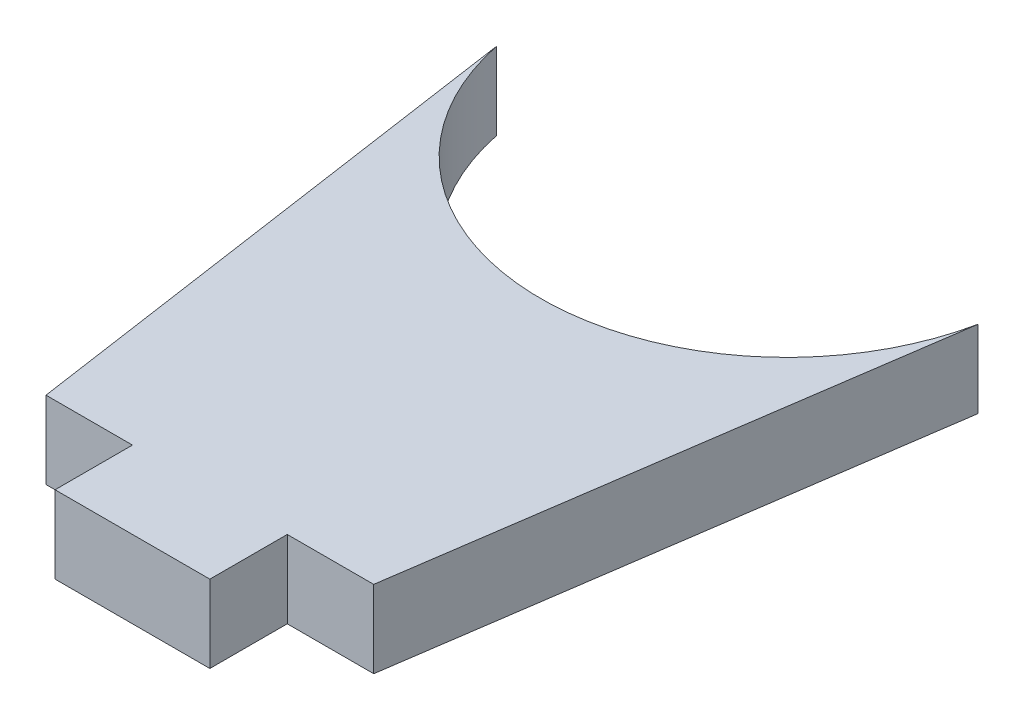
ISO-10303-21;
HEADER;
FILE_DESCRIPTION(('STEP AP214'),'2;1');
FILE_NAME('part.step','',(''),(''),'','','');
FILE_SCHEMA(('AUTOMOTIVE_DESIGN { 1 0 10303 214 1 1 1 1 }'));
ENDSEC;
DATA;
#1=APPLICATION_CONTEXT('core data for automotive mechanical design processes');
#2=APPLICATION_PROTOCOL_DEFINITION('international standard','automotive_design',2000,#1);
#3=PRODUCT_CONTEXT('',#1,'mechanical');
#4=PRODUCT('Part','Part','',(#3));
#5=PRODUCT_RELATED_PRODUCT_CATEGORY('part','',(#4));
#6=PRODUCT_DEFINITION_FORMATION('','',#4);
#7=PRODUCT_DEFINITION_CONTEXT('part definition',#1,'design');
#8=PRODUCT_DEFINITION('design','',#6,#7);
#9=PRODUCT_DEFINITION_SHAPE('','',#8);
#10=(LENGTH_UNIT() NAMED_UNIT(*) SI_UNIT(.MILLI.,.METRE.));
#11=(NAMED_UNIT(*) PLANE_ANGLE_UNIT() SI_UNIT($,.RADIAN.));
#12=(NAMED_UNIT(*) SI_UNIT($,.STERADIAN.) SOLID_ANGLE_UNIT());
#13=UNCERTAINTY_MEASURE_WITH_UNIT(LENGTH_MEASURE(1.E-05),#10,'distance_accuracy_value','');
#14=(GEOMETRIC_REPRESENTATION_CONTEXT(3) GLOBAL_UNCERTAINTY_ASSIGNED_CONTEXT((#13)) GLOBAL_UNIT_ASSIGNED_CONTEXT((#10,
#11,#12)) REPRESENTATION_CONTEXT('',''));
#15=CARTESIAN_POINT('',(0.,0.,0.));
#16=DIRECTION('',(0.,0.,1.));
#17=DIRECTION('',(1.,0.,0.));
#18=AXIS2_PLACEMENT_3D('',#15,#16,#17);
#19=CARTESIAN_POINT('',(0.,2.5,0.));
#20=DIRECTION('',(0.,-1.,0.));
#21=DIRECTION('',(0.,0.,-1.));
#22=AXIS2_PLACEMENT_3D('',#19,#20,#21);
#23=CYLINDRICAL_SURFACE('',#22,15.875);
#24=CARTESIAN_POINT('',(0.,-2.5,0.));
#25=DIRECTION('',(0.,1.,0.));
#26=DIRECTION('',(0.,0.,1.));
#27=AXIS2_PLACEMENT_3D('',#24,#25,#26);
#28=CIRCLE('',#27,15.875);
#29=CARTESIAN_POINT('',(-15.5513834842092,-2.5,3.1890589093123));
#30=VERTEX_POINT('',#29);
#31=CARTESIAN_POINT('',(15.5513834842092,-2.5,3.1890589093123));
#32=VERTEX_POINT('',#31);
#33=EDGE_CURVE('E131',#30,#32,#28,.T.);
#34=ORIENTED_EDGE('',*,*,#33,.F.);
#35=DIRECTION('',(0.,-1.,0.));
#36=VECTOR('',#35,1.);
#37=CARTESIAN_POINT('',(-15.5513834842092,2.5,3.1890589093123));
#38=LINE('',#37,#36);
#39=CARTESIAN_POINT('',(-15.5513834842092,2.5,3.1890589093123));
#40=VERTEX_POINT('',#39);
#41=EDGE_CURVE('E11',#40,#30,#38,.T.);
#42=ORIENTED_EDGE('',*,*,#41,.F.);
#43=CARTESIAN_POINT('',(0.,2.5,0.));
#44=DIRECTION('',(0.,1.,0.));
#45=DIRECTION('',(0.,0.,1.));
#46=AXIS2_PLACEMENT_3D('',#43,#44,#45);
#47=CIRCLE('',#46,15.875);
#48=CARTESIAN_POINT('',(15.5513834842092,2.5,3.1890589093123));
#49=VERTEX_POINT('',#48);
#50=EDGE_CURVE('E150',#40,#49,#47,.T.);
#51=ORIENTED_EDGE('',*,*,#50,.T.);
#52=DIRECTION('',(0.,-1.,0.));
#53=VECTOR('',#52,1.);
#54=CARTESIAN_POINT('',(15.5513834842092,2.5,3.1890589093123));
#55=LINE('',#54,#53);
#56=EDGE_CURVE('E89',#49,#32,#55,.T.);
#57=ORIENTED_EDGE('',*,*,#56,.T.);
#58=EDGE_LOOP('',(#34,#42,#51,#57));
#59=FACE_BOUND('',#58,.T.);
#60=ADVANCED_FACE('F39',(#59),#23,.F.);
#61=CARTESIAN_POINT('',(-15.6829871582078,2.5,2.28632816271574));
#62=DIRECTION('',(-0.989539954782991,0.,0.144259065185089));
#63=DIRECTION('',(0.144259065185089,0.,0.989539954782991));
#64=AXIS2_PLACEMENT_3D('',#61,#62,#63);
#65=PLANE('',#64);
#66=DIRECTION('',(-0.144259065185089,0.,-0.989539954782991));
#67=VECTOR('',#66,1.);
#68=CARTESIAN_POINT('',(-15.6829871582078,-2.5,2.28632816271574));
#69=LINE('',#68,#67);
#70=CARTESIAN_POINT('',(-10.5845908322065,-2.5,37.2585974161191));
#71=VERTEX_POINT('',#70);
#72=EDGE_CURVE('E134',#71,#30,#69,.T.);
#73=ORIENTED_EDGE('',*,*,#72,.F.);
#74=DIRECTION('',(0.,-1.,0.));
#75=VECTOR('',#74,1.);
#76=CARTESIAN_POINT('',(-10.5845908322065,2.5,37.2585974161191));
#77=LINE('',#76,#75);
#78=CARTESIAN_POINT('',(-10.5845908322065,2.5,37.2585974161191));
#79=VERTEX_POINT('',#78);
#80=EDGE_CURVE('E47',#79,#71,#77,.T.);
#81=ORIENTED_EDGE('',*,*,#80,.F.);
#82=DIRECTION('',(-0.144259065185089,0.,-0.989539954782991));
#83=VECTOR('',#82,1.);
#84=CARTESIAN_POINT('',(-15.6829871582078,2.5,2.28632816271574));
#85=LINE('',#84,#83);
#86=EDGE_CURVE('E183',#79,#40,#85,.T.);
#87=ORIENTED_EDGE('',*,*,#86,.T.);
#88=ORIENTED_EDGE('',*,*,#41,.T.);
#89=EDGE_LOOP('',(#73,#81,#87,#88));
#90=FACE_BOUND('',#89,.T.);
#91=ADVANCED_FACE('F168',(#90),#65,.T.);
#92=CARTESIAN_POINT('',(0.,2.5,37.2585974161191));
#93=DIRECTION('',(0.,0.,1.));
#94=DIRECTION('',(1.,0.,0.));
#95=AXIS2_PLACEMENT_3D('',#92,#93,#94);
#96=PLANE('',#95);
#97=DIRECTION('',(-1.,0.,0.));
#98=VECTOR('',#97,1.);
#99=CARTESIAN_POINT('',(0.,-2.5,37.2585974161191));
#100=LINE('',#99,#98);
#101=CARTESIAN_POINT('',(-5.,-2.5,37.2585974161191));
#102=VERTEX_POINT('',#101);
#103=EDGE_CURVE('E137',#102,#71,#100,.T.);
#104=ORIENTED_EDGE('',*,*,#103,.F.);
#105=DIRECTION('',(0.,-1.,0.));
#106=VECTOR('',#105,1.);
#107=CARTESIAN_POINT('',(-5.,2.5,37.2585974161191));
#108=LINE('',#107,#106);
#109=CARTESIAN_POINT('',(-5.,2.5,37.2585974161191));
#110=VERTEX_POINT('',#109);
#111=EDGE_CURVE('E157',#110,#102,#108,.T.);
#112=ORIENTED_EDGE('',*,*,#111,.F.);
#113=DIRECTION('',(-1.,0.,0.));
#114=VECTOR('',#113,1.);
#115=CARTESIAN_POINT('',(0.,2.5,37.2585974161191));
#116=LINE('',#115,#114);
#117=EDGE_CURVE('E164',#110,#79,#116,.T.);
#118=ORIENTED_EDGE('',*,*,#117,.T.);
#119=ORIENTED_EDGE('',*,*,#80,.T.);
#120=EDGE_LOOP('',(#104,#112,#118,#119));
#121=FACE_BOUND('',#120,.T.);
#122=ADVANCED_FACE('F162',(#121),#96,.T.);
#123=CARTESIAN_POINT('',(-5.,2.5,0.));
#124=DIRECTION('',(1.,0.,0.));
#125=DIRECTION('',(0.,0.,-1.));
#126=AXIS2_PLACEMENT_3D('',#123,#124,#125);
#127=PLANE('',#126);
#128=DIRECTION('',(0.,0.,1.));
#129=VECTOR('',#128,1.);
#130=CARTESIAN_POINT('',(-5.,-2.5,0.));
#131=LINE('',#130,#129);
#132=CARTESIAN_POINT('',(-5.,-2.5,42.2585974161191));
#133=VERTEX_POINT('',#132);
#134=EDGE_CURVE('E140',#102,#133,#131,.T.);
#135=ORIENTED_EDGE('',*,*,#134,.T.);
#136=DIRECTION('',(0.,-1.,0.));
#137=VECTOR('',#136,1.);
#138=CARTESIAN_POINT('',(-5.,2.5,42.2585974161191));
#139=LINE('',#138,#137);
#140=CARTESIAN_POINT('',(-5.,2.5,42.2585974161191));
#141=VERTEX_POINT('',#140);
#142=EDGE_CURVE('E154',#141,#133,#139,.T.);
#143=ORIENTED_EDGE('',*,*,#142,.F.);
#144=DIRECTION('',(0.,0.,1.));
#145=VECTOR('',#144,1.);
#146=CARTESIAN_POINT('',(-5.,2.5,0.));
#147=LINE('',#146,#145);
#148=EDGE_CURVE('E179',#110,#141,#147,.T.);
#149=ORIENTED_EDGE('',*,*,#148,.F.);
#150=ORIENTED_EDGE('',*,*,#111,.T.);
#151=EDGE_LOOP('',(#135,#143,#149,#150));
#152=FACE_BOUND('',#151,.T.);
#153=ADVANCED_FACE('F175',(#152),#127,.F.);
#154=CARTESIAN_POINT('',(0.,2.5,42.2585974161191));
#155=DIRECTION('',(0.,0.,-1.));
#156=DIRECTION('',(-1.,0.,0.));
#157=AXIS2_PLACEMENT_3D('',#154,#155,#156);
#158=PLANE('',#157);
#159=DIRECTION('',(1.,0.,0.));
#160=VECTOR('',#159,1.);
#161=CARTESIAN_POINT('',(0.,-2.5,42.2585974161191));
#162=LINE('',#161,#160);
#163=CARTESIAN_POINT('',(5.,-2.5,42.2585974161191));
#164=VERTEX_POINT('',#163);
#165=EDGE_CURVE('E142',#133,#164,#162,.T.);
#166=ORIENTED_EDGE('',*,*,#165,.T.);
#167=DIRECTION('',(0.,-1.,0.));
#168=VECTOR('',#167,1.);
#169=CARTESIAN_POINT('',(5.,2.5,42.2585974161191));
#170=LINE('',#169,#168);
#171=CARTESIAN_POINT('',(5.,2.5,42.2585974161191));
#172=VERTEX_POINT('',#171);
#173=EDGE_CURVE('E118',#172,#164,#170,.T.);
#174=ORIENTED_EDGE('',*,*,#173,.F.);
#175=DIRECTION('',(1.,0.,0.));
#176=VECTOR('',#175,1.);
#177=CARTESIAN_POINT('',(0.,2.5,42.2585974161191));
#178=LINE('',#177,#176);
#179=EDGE_CURVE('E123',#141,#172,#178,.T.);
#180=ORIENTED_EDGE('',*,*,#179,.F.);
#181=ORIENTED_EDGE('',*,*,#142,.T.);
#182=EDGE_LOOP('',(#166,#174,#180,#181));
#183=FACE_BOUND('',#182,.T.);
#184=ADVANCED_FACE('F178',(#183),#158,.F.);
#185=CARTESIAN_POINT('',(4.99999999999998,2.5,0.));
#186=DIRECTION('',(1.,0.,0.));
#187=DIRECTION('',(0.,0.,-1.));
#188=AXIS2_PLACEMENT_3D('',#185,#186,#187);
#189=PLANE('',#188);
#190=DIRECTION('',(0.,0.,1.));
#191=VECTOR('',#190,1.);
#192=CARTESIAN_POINT('',(4.99999999999998,-2.5,0.));
#193=LINE('',#192,#191);
#194=CARTESIAN_POINT('',(5.,-2.5,37.2585974161191));
#195=VERTEX_POINT('',#194);
#196=EDGE_CURVE('E113',#195,#164,#193,.T.);
#197=ORIENTED_EDGE('',*,*,#196,.F.);
#198=DIRECTION('',(0.,-1.,0.));
#199=VECTOR('',#198,1.);
#200=CARTESIAN_POINT('',(5.,2.5,37.2585974161191));
#201=LINE('',#200,#199);
#202=CARTESIAN_POINT('',(5.,2.5,37.2585974161191));
#203=VERTEX_POINT('',#202);
#204=EDGE_CURVE('E108',#203,#195,#201,.T.);
#205=ORIENTED_EDGE('',*,*,#204,.F.);
#206=DIRECTION('',(0.,0.,1.));
#207=VECTOR('',#206,1.);
#208=CARTESIAN_POINT('',(4.99999999999998,2.5,0.));
#209=LINE('',#208,#207);
#210=EDGE_CURVE('E111',#203,#172,#209,.T.);
#211=ORIENTED_EDGE('',*,*,#210,.T.);
#212=ORIENTED_EDGE('',*,*,#173,.T.);
#213=EDGE_LOOP('',(#197,#205,#211,#212));
#214=FACE_BOUND('',#213,.T.);
#215=ADVANCED_FACE('F110',(#214),#189,.T.);
#216=CARTESIAN_POINT('',(0.,2.5,37.2585974161191));
#217=DIRECTION('',(0.,0.,1.));
#218=DIRECTION('',(1.,0.,0.));
#219=AXIS2_PLACEMENT_3D('',#216,#217,#218);
#220=PLANE('',#219);
#221=DIRECTION('',(-1.,0.,0.));
#222=VECTOR('',#221,1.);
#223=CARTESIAN_POINT('',(0.,-2.5,37.2585974161191));
#224=LINE('',#223,#222);
#225=CARTESIAN_POINT('',(10.5845908322065,-2.5,37.2585974161191));
#226=VERTEX_POINT('',#225);
#227=EDGE_CURVE('E146',#226,#195,#224,.T.);
#228=ORIENTED_EDGE('',*,*,#227,.F.);
#229=DIRECTION('',(0.,-1.,0.));
#230=VECTOR('',#229,1.);
#231=CARTESIAN_POINT('',(10.5845908322065,2.5,37.2585974161191));
#232=LINE('',#231,#230);
#233=CARTESIAN_POINT('',(10.5845908322065,2.5,37.2585974161191));
#234=VERTEX_POINT('',#233);
#235=EDGE_CURVE('E82',#234,#226,#232,.T.);
#236=ORIENTED_EDGE('',*,*,#235,.F.);
#237=DIRECTION('',(-1.,0.,0.));
#238=VECTOR('',#237,1.);
#239=CARTESIAN_POINT('',(0.,2.5,37.2585974161191));
#240=LINE('',#239,#238);
#241=EDGE_CURVE('E121',#234,#203,#240,.T.);
#242=ORIENTED_EDGE('',*,*,#241,.T.);
#243=ORIENTED_EDGE('',*,*,#204,.T.);
#244=EDGE_LOOP('',(#228,#236,#242,#243));
#245=FACE_BOUND('',#244,.T.);
#246=ADVANCED_FACE('F126',(#245),#220,.T.);
#247=CARTESIAN_POINT('',(15.6829871582078,2.5,2.28632816271574));
#248=DIRECTION('',(-0.989539954782991,0.,-0.144259065185089));
#249=DIRECTION('',(-0.144259065185089,0.,0.989539954782991));
#250=AXIS2_PLACEMENT_3D('',#247,#248,#249);
#251=PLANE('',#250);
#252=DIRECTION('',(0.144259065185089,0.,-0.989539954782991));
#253=VECTOR('',#252,1.);
#254=CARTESIAN_POINT('',(15.6829871582078,-2.5,2.28632816271574));
#255=LINE('',#254,#253);
#256=EDGE_CURVE('E148',#226,#32,#255,.T.);
#257=ORIENTED_EDGE('',*,*,#256,.T.);
#258=ORIENTED_EDGE('',*,*,#56,.F.);
#259=DIRECTION('',(0.144259065185089,0.,-0.989539954782991));
#260=VECTOR('',#259,1.);
#261=CARTESIAN_POINT('',(15.6829871582078,2.5,2.28632816271574));
#262=LINE('',#261,#260);
#263=EDGE_CURVE('E55',#234,#49,#262,.T.);
#264=ORIENTED_EDGE('',*,*,#263,.F.);
#265=ORIENTED_EDGE('',*,*,#235,.T.);
#266=EDGE_LOOP('',(#257,#258,#264,#265));
#267=FACE_BOUND('',#266,.T.);
#268=ADVANCED_FACE('F202',(#267),#251,.F.);
#269=CARTESIAN_POINT('',(0.,2.5,0.));
#270=DIRECTION('',(0.,1.,0.));
#271=DIRECTION('',(0.,0.,1.));
#272=AXIS2_PLACEMENT_3D('',#269,#270,#271);
#273=PLANE('',#272);
#274=ORIENTED_EDGE('',*,*,#50,.F.);
#275=ORIENTED_EDGE('',*,*,#86,.F.);
#276=ORIENTED_EDGE('',*,*,#117,.F.);
#277=ORIENTED_EDGE('',*,*,#148,.T.);
#278=ORIENTED_EDGE('',*,*,#179,.T.);
#279=ORIENTED_EDGE('',*,*,#210,.F.);
#280=ORIENTED_EDGE('',*,*,#241,.F.);
#281=ORIENTED_EDGE('',*,*,#263,.T.);
#282=EDGE_LOOP('',(#274,#275,#276,#277,#278,#279,#280,#281));
#283=FACE_BOUND('',#282,.T.);
#284=ADVANCED_FACE('F120',(#283),#273,.T.);
#285=CARTESIAN_POINT('',(0.,-2.5,0.));
#286=DIRECTION('',(0.,1.,0.));
#287=DIRECTION('',(0.,0.,1.));
#288=AXIS2_PLACEMENT_3D('',#285,#286,#287);
#289=PLANE('',#288);
#290=ORIENTED_EDGE('',*,*,#33,.T.);
#291=ORIENTED_EDGE('',*,*,#256,.F.);
#292=ORIENTED_EDGE('',*,*,#227,.T.);
#293=ORIENTED_EDGE('',*,*,#196,.T.);
#294=ORIENTED_EDGE('',*,*,#165,.F.);
#295=ORIENTED_EDGE('',*,*,#134,.F.);
#296=ORIENTED_EDGE('',*,*,#103,.T.);
#297=ORIENTED_EDGE('',*,*,#72,.T.);
#298=EDGE_LOOP('',(#290,#291,#292,#293,#294,#295,#296,#297));
#299=FACE_BOUND('',#298,.T.);
#300=ADVANCED_FACE('F171',(#299),#289,.F.);
#301=CLOSED_SHELL('',(#60,#91,#122,#153,#184,#215,#246,#268,#284,#300));
#302=MANIFOLD_SOLID_BREP('B2',#301);
#303=ADVANCED_BREP_SHAPE_REPRESENTATION('',(#18,#302),#14);
#304=SHAPE_DEFINITION_REPRESENTATION(#9,#303);
ENDSEC;
END-ISO-10303-21;
